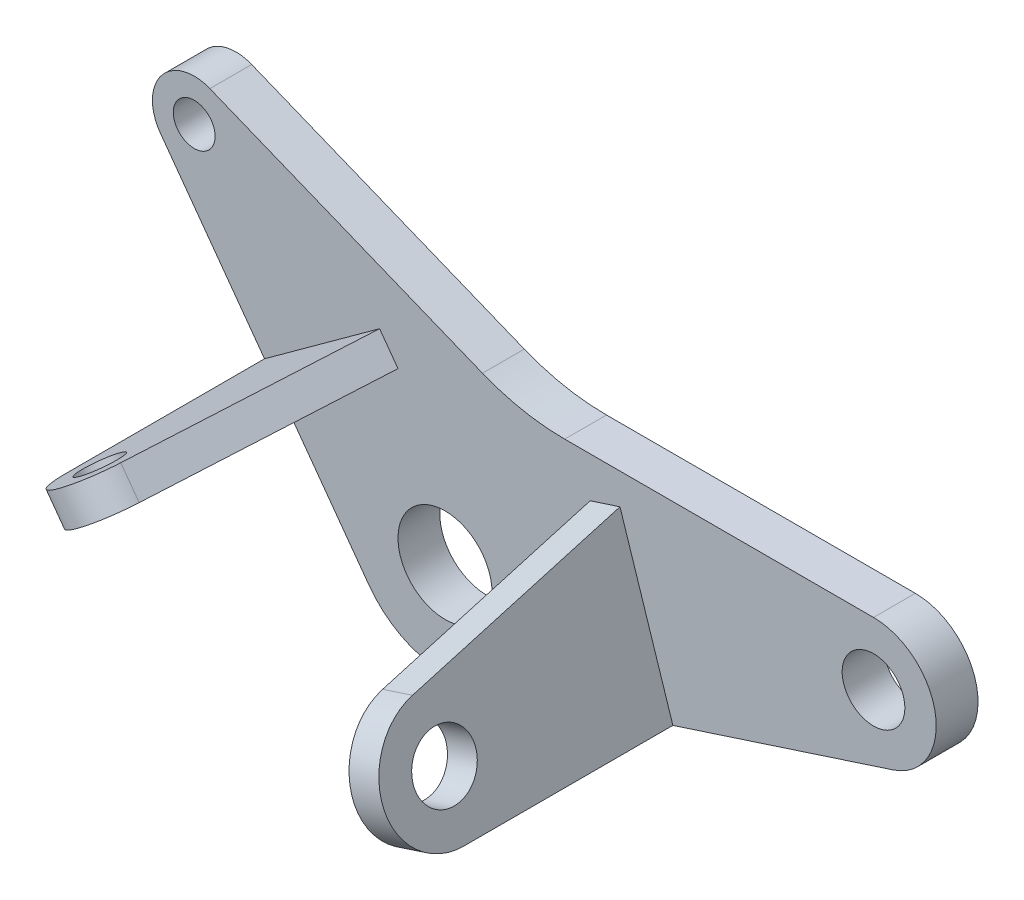
ISO-10303-21;
HEADER;
FILE_DESCRIPTION(('STEP AP214'),'2;1');
FILE_NAME('part.step','',(''),(''),'','','');
FILE_SCHEMA(('AUTOMOTIVE_DESIGN { 1 0 10303 214 1 1 1 1 }'));
ENDSEC;
DATA;
#1=APPLICATION_CONTEXT('core data for automotive mechanical design processes');
#2=APPLICATION_PROTOCOL_DEFINITION('international standard','automotive_design',2000,#1);
#3=PRODUCT_CONTEXT('',#1,'mechanical');
#4=PRODUCT('Part','Part','',(#3));
#5=PRODUCT_RELATED_PRODUCT_CATEGORY('part','',(#4));
#6=PRODUCT_DEFINITION_FORMATION('','',#4);
#7=PRODUCT_DEFINITION_CONTEXT('part definition',#1,'design');
#8=PRODUCT_DEFINITION('design','',#6,#7);
#9=PRODUCT_DEFINITION_SHAPE('','',#8);
#10=(LENGTH_UNIT() NAMED_UNIT(*) SI_UNIT(.MILLI.,.METRE.));
#11=(NAMED_UNIT(*) PLANE_ANGLE_UNIT() SI_UNIT($,.RADIAN.));
#12=(NAMED_UNIT(*) SI_UNIT($,.STERADIAN.) SOLID_ANGLE_UNIT());
#13=UNCERTAINTY_MEASURE_WITH_UNIT(LENGTH_MEASURE(1.E-05),#10,'distance_accuracy_value','');
#14=(GEOMETRIC_REPRESENTATION_CONTEXT(3) GLOBAL_UNCERTAINTY_ASSIGNED_CONTEXT((#13)) GLOBAL_UNIT_ASSIGNED_CONTEXT((#10,
#11,#12)) REPRESENTATION_CONTEXT('',''));
#15=CARTESIAN_POINT('',(0.,0.,0.));
#16=DIRECTION('',(0.,0.,1.));
#17=DIRECTION('',(1.,0.,0.));
#18=AXIS2_PLACEMENT_3D('',#15,#16,#17);
#19=CARTESIAN_POINT('',(0.,0.,8.));
#20=DIRECTION('',(0.,0.,1.));
#21=DIRECTION('',(1.,0.,0.));
#22=AXIS2_PLACEMENT_3D('',#19,#20,#21);
#23=PLANE('',#22);
#24=CARTESIAN_POINT('',(0.,0.,8.));
#25=DIRECTION('',(0.,0.,1.));
#26=DIRECTION('',(1.,0.,0.));
#27=AXIS2_PLACEMENT_3D('',#24,#25,#26);
#28=CIRCLE('',#27,9.);
#29=CARTESIAN_POINT('',(9.,0.,8.));
#30=VERTEX_POINT('',#29);
#31=EDGE_CURVE('E224',#30,#30,#28,.T.);
#32=ORIENTED_EDGE('',*,*,#31,.F.);
#33=EDGE_LOOP('',(#32));
#34=FACE_BOUND('',#33,.T.);
#35=CARTESIAN_POINT('',(82.,20.3346417456688,8.));
#36=DIRECTION('',(0.,0.,1.));
#37=DIRECTION('',(1.,0.,0.));
#38=AXIS2_PLACEMENT_3D('',#35,#36,#37);
#39=CIRCLE('',#38,6.);
#40=CARTESIAN_POINT('',(88.,20.3346417456688,8.));
#41=VERTEX_POINT('',#40);
#42=EDGE_CURVE('E226',#41,#41,#39,.T.);
#43=ORIENTED_EDGE('',*,*,#42,.F.);
#44=EDGE_LOOP('',(#43));
#45=FACE_BOUND('',#44,.T.);
#46=CARTESIAN_POINT('',(-48.,49.0533160155749,8.));
#47=DIRECTION('',(0.,0.,1.));
#48=DIRECTION('',(1.,0.,0.));
#49=AXIS2_PLACEMENT_3D('',#46,#47,#48);
#50=CIRCLE('',#49,4.);
#51=CARTESIAN_POINT('',(-44.,49.0533160155749,8.));
#52=VERTEX_POINT('',#51);
#53=EDGE_CURVE('E229',#52,#52,#50,.T.);
#54=ORIENTED_EDGE('',*,*,#53,.F.);
#55=EDGE_LOOP('',(#54));
#56=FACE_BOUND('',#55,.T.);
#57=DIRECTION('',(0.951056516295153,0.309016994374949,0.));
#58=VECTOR('',#57,1.);
#59=CARTESIAN_POINT('',(5.56230589874907,-17.1190172933128,8.));
#60=LINE('',#59,#58);
#61=CARTESIAN_POINT('',(5.56230589874907,-17.1190172933128,8.));
#62=VERTEX_POINT('',#61);
#63=CARTESIAN_POINT('',(37.8982274527843,-6.6124394845645,8.));
#64=VERTEX_POINT('',#63);
#65=EDGE_CURVE('E247',#62,#64,#60,.T.);
#66=ORIENTED_EDGE('',*,*,#65,.T.);
#67=DIRECTION('',(-0.309016994374949,0.951056516295153,0.));
#68=VECTOR('',#67,1.);
#69=CARTESIAN_POINT('',(27.7716325131749,24.5540150487133,8.));
#70=LINE('',#69,#68);
#71=CARTESIAN_POINT('',(27.7716325131749,24.5540150487133,8.));
#72=VERTEX_POINT('',#71);
#73=EDGE_CURVE('E178',#64,#72,#70,.T.);
#74=ORIENTED_EDGE('',*,*,#73,.T.);
#75=DIRECTION('',(-0.951056516295153,-0.309016994374949,0.));
#76=VECTOR('',#75,1.);
#77=CARTESIAN_POINT('',(33.4779716109458,26.408117014963,8.));
#78=LINE('',#77,#76);
#79=CARTESIAN_POINT('',(33.4779716109458,26.408117014963,8.));
#80=VERTEX_POINT('',#79);
#81=EDGE_CURVE('E166',#80,#72,#78,.T.);
#82=ORIENTED_EDGE('',*,*,#81,.F.);
#83=DIRECTION('',(-0.309016994374949,0.951056516295153,0.));
#84=VECTOR('',#83,1.);
#85=CARTESIAN_POINT('',(33.4779716109458,26.408117014963,8.));
#86=LINE('',#85,#84);
#87=CARTESIAN_POINT('',(43.6045665505552,-4.75833751831481,8.));
#88=VERTEX_POINT('',#87);
#89=EDGE_CURVE('E57',#88,#80,#86,.T.);
#90=ORIENTED_EDGE('',*,*,#89,.F.);
#91=CARTESIAN_POINT('',(85.7082039324994,8.92196355012699,8.));
#92=VERTEX_POINT('',#91);
#93=EDGE_CURVE('E244',#88,#92,#60,.T.);
#94=ORIENTED_EDGE('',*,*,#93,.T.);
#95=CARTESIAN_POINT('',(82.,20.3346417456688,8.));
#96=DIRECTION('',(0.,0.,1.));
#97=DIRECTION('',(1.,0.,0.));
#98=AXIS2_PLACEMENT_3D('',#95,#96,#97);
#99=CIRCLE('',#98,12.);
#100=CARTESIAN_POINT('',(82.,32.3346417456688,8.));
#101=VERTEX_POINT('',#100);
#102=EDGE_CURVE('E246',#92,#101,#99,.T.);
#103=ORIENTED_EDGE('',*,*,#102,.T.);
#104=DIRECTION('',(1.,0.,0.));
#105=VECTOR('',#104,1.);
#106=CARTESIAN_POINT('',(0.,32.3346417456688,8.));
#107=LINE('',#106,#105);
#108=CARTESIAN_POINT('',(22.8998811762111,32.3346417456688,8.));
#109=VERTEX_POINT('',#108);
#110=EDGE_CURVE('E253',#109,#101,#107,.T.);
#111=ORIENTED_EDGE('',*,*,#110,.F.);
#112=CARTESIAN_POINT('',(22.8998811762111,74.3346417456688,8.));
#113=DIRECTION('',(0.,0.,1.));
#114=DIRECTION('',(1.,0.,0.));
#115=AXIS2_PLACEMENT_3D('',#112,#113,#114);
#116=CIRCLE('',#115,42.);
#117=CARTESIAN_POINT('',(7.16640425274299,35.3929198538637,8.));
#118=VERTEX_POINT('',#117);
#119=EDGE_CURVE('E255',#118,#109,#116,.T.);
#120=ORIENTED_EDGE('',*,*,#119,.F.);
#121=DIRECTION('',(-0.92718385456679,0.374606593415907,0.));
#122=VECTOR('',#121,1.);
#123=CARTESIAN_POINT('',(13.2986562399496,32.9153292276025,8.));
#124=LINE('',#123,#122);
#125=CARTESIAN_POINT('',(-45.0031472526728,56.4707868521092,8.));
#126=VERTEX_POINT('',#125);
#127=EDGE_CURVE('E234',#118,#126,#124,.T.);
#128=ORIENTED_EDGE('',*,*,#127,.T.);
#129=CARTESIAN_POINT('',(-48.,49.0533160155749,8.));
#130=DIRECTION('',(0.,0.,1.));
#131=DIRECTION('',(1.,0.,0.));
#132=AXIS2_PLACEMENT_3D('',#129,#130,#131);
#133=CIRCLE('',#132,8.);
#134=CARTESIAN_POINT('',(-54.4721359549996,44.3510339972351,8.));
#135=VERTEX_POINT('',#134);
#136=EDGE_CURVE('E237',#126,#135,#133,.T.);
#137=ORIENTED_EDGE('',*,*,#136,.T.);
#138=DIRECTION('',(-0.587785252292478,0.809016994374944,0.));
#139=VECTOR('',#138,1.);
#140=CARTESIAN_POINT('',(-14.562305898749,-10.5801345412646,8.));
#141=LINE('',#140,#139);
#142=CARTESIAN_POINT('',(-34.5470044766932,16.9264432674835,8.));
#143=VERTEX_POINT('',#142);
#144=EDGE_CURVE('E239',#143,#135,#141,.T.);
#145=ORIENTED_EDGE('',*,*,#144,.F.);
#146=DIRECTION('',(-0.809016994374944,-0.587785252292478,0.));
#147=VECTOR('',#146,1.);
#148=CARTESIAN_POINT('',(-19.9846985779443,27.5065778087481,8.));
#149=LINE('',#148,#147);
#150=CARTESIAN_POINT('',(-12.5265973136641,32.9252055554183,8.));
#151=VERTEX_POINT('',#150);
#152=EDGE_CURVE('E198',#151,#143,#149,.T.);
#153=ORIENTED_EDGE('',*,*,#152,.F.);
#154=DIRECTION('',(-0.587785252292478,0.809016994374944,0.));
#155=VECTOR('',#154,1.);
#156=CARTESIAN_POINT('',(-8.99988579990927,28.0711035891686,8.));
#157=LINE('',#156,#155);
#158=CARTESIAN_POINT('',(-8.99988579990927,28.0711035891686,8.));
#159=VERTEX_POINT('',#158);
#160=EDGE_CURVE('E201',#159,#151,#157,.T.);
#161=ORIENTED_EDGE('',*,*,#160,.F.);
#162=DIRECTION('',(-0.809016994374944,-0.587785252292478,0.));
#163=VECTOR('',#162,1.);
#164=CARTESIAN_POINT('',(-16.4579870641894,22.6524758424985,8.));
#165=LINE('',#164,#163);
#166=CARTESIAN_POINT('',(-31.0202929629384,12.0723413012339,8.));
#167=VERTEX_POINT('',#166);
#168=EDGE_CURVE('E203',#159,#167,#165,.T.);
#169=ORIENTED_EDGE('',*,*,#168,.T.);
#170=CARTESIAN_POINT('',(-14.562305898749,-10.5801345412646,8.));
#171=VERTEX_POINT('',#170);
#172=EDGE_CURVE('E238',#171,#167,#141,.T.);
#173=ORIENTED_EDGE('',*,*,#172,.F.);
#174=CARTESIAN_POINT('',(0.,0.,8.));
#175=DIRECTION('',(0.,0.,1.));
#176=DIRECTION('',(1.,0.,0.));
#177=AXIS2_PLACEMENT_3D('',#174,#175,#176);
#178=CIRCLE('',#177,18.);
#179=EDGE_CURVE('E242',#171,#62,#178,.T.);
#180=ORIENTED_EDGE('',*,*,#179,.T.);
#181=EDGE_LOOP('',(#66,#74,#82,#90,#94,#103,#111,#120,#128,#137,#145,#153,#161,#169,#173,#180));
#182=FACE_BOUND('',#181,.T.);
#183=ADVANCED_FACE('F41',(#34,#45,#56,#182),#23,.T.);
#184=CARTESIAN_POINT('',(13.2986562399496,32.9153292276025,8.));
#185=DIRECTION('',(-0.374606593415907,-0.92718385456679,0.));
#186=DIRECTION('',(0.92718385456679,-0.374606593415907,0.));
#187=AXIS2_PLACEMENT_3D('',#184,#185,#186);
#188=PLANE('',#187);
#189=DIRECTION('',(-0.92718385456679,0.374606593415907,0.));
#190=VECTOR('',#189,1.);
#191=CARTESIAN_POINT('',(13.2986562399496,32.9153292276025,0.));
#192=LINE('',#191,#190);
#193=CARTESIAN_POINT('',(7.16640425274299,35.3929198538637,0.));
#194=VERTEX_POINT('',#193);
#195=CARTESIAN_POINT('',(-45.0031472526728,56.4707868521092,0.));
#196=VERTEX_POINT('',#195);
#197=EDGE_CURVE('E266',#194,#196,#192,.T.);
#198=ORIENTED_EDGE('',*,*,#197,.T.);
#199=DIRECTION('',(0.,0.,-1.));
#200=VECTOR('',#199,1.);
#201=CARTESIAN_POINT('',(-45.0031472526728,56.4707868521092,8.));
#202=LINE('',#201,#200);
#203=EDGE_CURVE('E11',#126,#196,#202,.T.);
#204=ORIENTED_EDGE('',*,*,#203,.F.);
#205=ORIENTED_EDGE('',*,*,#127,.F.);
#206=DIRECTION('',(0.,0.,-1.));
#207=VECTOR('',#206,1.);
#208=CARTESIAN_POINT('',(7.16640425274299,35.3929198538637,8.));
#209=LINE('',#208,#207);
#210=EDGE_CURVE('E260',#118,#194,#209,.T.);
#211=ORIENTED_EDGE('',*,*,#210,.T.);
#212=EDGE_LOOP('',(#198,#204,#205,#211));
#213=FACE_BOUND('',#212,.T.);
#214=ADVANCED_FACE('F338',(#213),#188,.F.);
#215=CARTESIAN_POINT('',(-48.,49.0533160155749,8.));
#216=DIRECTION('',(0.,0.,-1.));
#217=DIRECTION('',(-1.,0.,0.));
#218=AXIS2_PLACEMENT_3D('',#215,#216,#217);
#219=CYLINDRICAL_SURFACE('',#218,8.);
#220=CARTESIAN_POINT('',(-48.,49.0533160155749,0.));
#221=DIRECTION('',(0.,0.,1.));
#222=DIRECTION('',(1.,0.,0.));
#223=AXIS2_PLACEMENT_3D('',#220,#221,#222);
#224=CIRCLE('',#223,8.);
#225=CARTESIAN_POINT('',(-54.4721359549996,44.3510339972351,0.));
#226=VERTEX_POINT('',#225);
#227=EDGE_CURVE('E267',#196,#226,#224,.T.);
#228=ORIENTED_EDGE('',*,*,#227,.T.);
#229=DIRECTION('',(0.,0.,-1.));
#230=VECTOR('',#229,1.);
#231=CARTESIAN_POINT('',(-54.4721359549996,44.3510339972351,8.));
#232=LINE('',#231,#230);
#233=EDGE_CURVE('E47',#135,#226,#232,.T.);
#234=ORIENTED_EDGE('',*,*,#233,.F.);
#235=ORIENTED_EDGE('',*,*,#136,.F.);
#236=ORIENTED_EDGE('',*,*,#203,.T.);
#237=EDGE_LOOP('',(#228,#234,#235,#236));
#238=FACE_BOUND('',#237,.T.);
#239=ADVANCED_FACE('F303',(#238),#219,.T.);
#240=CARTESIAN_POINT('',(-14.562305898749,-10.5801345412646,8.));
#241=DIRECTION('',(-0.809016994374944,-0.587785252292478,0.));
#242=DIRECTION('',(0.587785252292478,-0.809016994374944,0.));
#243=AXIS2_PLACEMENT_3D('',#240,#241,#242);
#244=PLANE('',#243);
#245=DIRECTION('',(-0.587785252292478,0.809016994374944,0.));
#246=VECTOR('',#245,1.);
#247=CARTESIAN_POINT('',(-14.562305898749,-10.5801345412646,0.));
#248=LINE('',#247,#246);
#249=CARTESIAN_POINT('',(-14.562305898749,-10.5801345412646,0.));
#250=VERTEX_POINT('',#249);
#251=EDGE_CURVE('E275',#250,#226,#248,.T.);
#252=ORIENTED_EDGE('',*,*,#251,.F.);
#253=DIRECTION('',(0.,0.,-1.));
#254=VECTOR('',#253,1.);
#255=CARTESIAN_POINT('',(-14.562305898749,-10.5801345412646,8.));
#256=LINE('',#255,#254);
#257=EDGE_CURVE('E297',#171,#250,#256,.T.);
#258=ORIENTED_EDGE('',*,*,#257,.F.);
#259=ORIENTED_EDGE('',*,*,#172,.T.);
#260=DIRECTION('',(0.,0.,1.));
#261=VECTOR('',#260,1.);
#262=CARTESIAN_POINT('',(-31.0202929629384,12.0723413012339,0.));
#263=LINE('',#262,#261);
#264=CARTESIAN_POINT('',(-31.0202929629384,12.0723413012339,46.));
#265=VERTEX_POINT('',#264);
#266=EDGE_CURVE('E63',#167,#265,#263,.T.);
#267=ORIENTED_EDGE('',*,*,#266,.T.);
#268=DIRECTION('',(-0.587785252292478,0.809016994374944,0.));
#269=VECTOR('',#268,1.);
#270=CARTESIAN_POINT('',(-31.0202929629384,12.0723413012339,46.));
#271=LINE('',#270,#269);
#272=CARTESIAN_POINT('',(-34.5470044766932,16.9264432674835,46.));
#273=VERTEX_POINT('',#272);
#274=EDGE_CURVE('E217',#265,#273,#271,.T.);
#275=ORIENTED_EDGE('',*,*,#274,.T.);
#276=DIRECTION('',(0.,0.,1.));
#277=VECTOR('',#276,1.);
#278=CARTESIAN_POINT('',(-34.5470044766932,16.9264432674835,0.));
#279=LINE('',#278,#277);
#280=EDGE_CURVE('E215',#143,#273,#279,.T.);
#281=ORIENTED_EDGE('',*,*,#280,.F.);
#282=ORIENTED_EDGE('',*,*,#144,.T.);
#283=ORIENTED_EDGE('',*,*,#233,.T.);
#284=EDGE_LOOP('',(#252,#258,#259,#267,#275,#281,#282,#283));
#285=FACE_BOUND('',#284,.T.);
#286=ADVANCED_FACE('F305',(#285),#244,.T.);
#287=CARTESIAN_POINT('',(0.,0.,8.));
#288=DIRECTION('',(0.,0.,-1.));
#289=DIRECTION('',(-1.,0.,0.));
#290=AXIS2_PLACEMENT_3D('',#287,#288,#289);
#291=CYLINDRICAL_SURFACE('',#290,18.);
#292=CARTESIAN_POINT('',(0.,0.,0.));
#293=DIRECTION('',(0.,0.,1.));
#294=DIRECTION('',(1.,0.,0.));
#295=AXIS2_PLACEMENT_3D('',#292,#293,#294);
#296=CIRCLE('',#295,18.);
#297=CARTESIAN_POINT('',(5.56230589874907,-17.1190172933128,0.));
#298=VERTEX_POINT('',#297);
#299=EDGE_CURVE('E274',#250,#298,#296,.T.);
#300=ORIENTED_EDGE('',*,*,#299,.T.);
#301=DIRECTION('',(0.,0.,-1.));
#302=VECTOR('',#301,1.);
#303=CARTESIAN_POINT('',(5.56230589874907,-17.1190172933128,8.));
#304=LINE('',#303,#302);
#305=EDGE_CURVE('E293',#62,#298,#304,.T.);
#306=ORIENTED_EDGE('',*,*,#305,.F.);
#307=ORIENTED_EDGE('',*,*,#179,.F.);
#308=ORIENTED_EDGE('',*,*,#257,.T.);
#309=EDGE_LOOP('',(#300,#306,#307,#308));
#310=FACE_BOUND('',#309,.T.);
#311=ADVANCED_FACE('F312',(#310),#291,.T.);
#312=CARTESIAN_POINT('',(5.56230589874907,-17.1190172933128,8.));
#313=DIRECTION('',(-0.309016994374949,0.951056516295153,0.));
#314=DIRECTION('',(-0.951056516295153,-0.309016994374949,0.));
#315=AXIS2_PLACEMENT_3D('',#312,#313,#314);
#316=PLANE('',#315);
#317=DIRECTION('',(0.951056516295153,0.309016994374949,0.));
#318=VECTOR('',#317,1.);
#319=CARTESIAN_POINT('',(5.56230589874907,-17.1190172933128,0.));
#320=LINE('',#319,#318);
#321=CARTESIAN_POINT('',(85.7082039324994,8.92196355012699,0.));
#322=VERTEX_POINT('',#321);
#323=EDGE_CURVE('E280',#298,#322,#320,.T.);
#324=ORIENTED_EDGE('',*,*,#323,.T.);
#325=DIRECTION('',(0.,0.,-1.));
#326=VECTOR('',#325,1.);
#327=CARTESIAN_POINT('',(85.7082039324994,8.92196355012699,8.));
#328=LINE('',#327,#326);
#329=EDGE_CURVE('E295',#92,#322,#328,.T.);
#330=ORIENTED_EDGE('',*,*,#329,.F.);
#331=ORIENTED_EDGE('',*,*,#93,.F.);
#332=DIRECTION('',(0.,0.,-1.));
#333=VECTOR('',#332,1.);
#334=CARTESIAN_POINT('',(43.6045665505552,-4.75833751831481,8.));
#335=LINE('',#334,#333);
#336=CARTESIAN_POINT('',(43.6045665505552,-4.75833751831481,48.));
#337=VERTEX_POINT('',#336);
#338=EDGE_CURVE('E174',#337,#88,#335,.T.);
#339=ORIENTED_EDGE('',*,*,#338,.F.);
#340=DIRECTION('',(-0.951056516295153,-0.309016994374949,0.));
#341=VECTOR('',#340,1.);
#342=CARTESIAN_POINT('',(43.6045665505552,-4.75833751831481,48.));
#343=LINE('',#342,#341);
#344=CARTESIAN_POINT('',(37.8982274527843,-6.61243948456451,48.));
#345=VERTEX_POINT('',#344);
#346=EDGE_CURVE('E168',#337,#345,#343,.T.);
#347=ORIENTED_EDGE('',*,*,#346,.T.);
#348=DIRECTION('',(0.,0.,-1.));
#349=VECTOR('',#348,1.);
#350=CARTESIAN_POINT('',(37.8982274527843,-6.6124394845645,8.));
#351=LINE('',#350,#349);
#352=EDGE_CURVE('E190',#345,#64,#351,.T.);
#353=ORIENTED_EDGE('',*,*,#352,.T.);
#354=ORIENTED_EDGE('',*,*,#65,.F.);
#355=ORIENTED_EDGE('',*,*,#305,.T.);
#356=EDGE_LOOP('',(#324,#330,#331,#339,#347,#353,#354,#355));
#357=FACE_BOUND('',#356,.T.);
#358=ADVANCED_FACE('F317',(#357),#316,.F.);
#359=CARTESIAN_POINT('',(82.,20.3346417456688,8.));
#360=DIRECTION('',(0.,0.,-1.));
#361=DIRECTION('',(-1.,0.,0.));
#362=AXIS2_PLACEMENT_3D('',#359,#360,#361);
#363=CYLINDRICAL_SURFACE('',#362,12.);
#364=CARTESIAN_POINT('',(82.,20.3346417456688,0.));
#365=DIRECTION('',(0.,0.,1.));
#366=DIRECTION('',(1.,0.,0.));
#367=AXIS2_PLACEMENT_3D('',#364,#365,#366);
#368=CIRCLE('',#367,12.);
#369=CARTESIAN_POINT('',(82.,32.3346417456688,0.));
#370=VERTEX_POINT('',#369);
#371=EDGE_CURVE('E276',#322,#370,#368,.T.);
#372=ORIENTED_EDGE('',*,*,#371,.T.);
#373=DIRECTION('',(0.,0.,-1.));
#374=VECTOR('',#373,1.);
#375=CARTESIAN_POINT('',(82.,32.3346417456688,8.));
#376=LINE('',#375,#374);
#377=EDGE_CURVE('E288',#101,#370,#376,.T.);
#378=ORIENTED_EDGE('',*,*,#377,.F.);
#379=ORIENTED_EDGE('',*,*,#102,.F.);
#380=ORIENTED_EDGE('',*,*,#329,.T.);
#381=EDGE_LOOP('',(#372,#378,#379,#380));
#382=FACE_BOUND('',#381,.T.);
#383=ADVANCED_FACE('F346',(#382),#363,.T.);
#384=CARTESIAN_POINT('',(0.,32.3346417456688,8.));
#385=DIRECTION('',(0.,1.,0.));
#386=DIRECTION('',(-1.,0.,0.));
#387=AXIS2_PLACEMENT_3D('',#384,#385,#386);
#388=PLANE('',#387);
#389=DIRECTION('',(1.,0.,0.));
#390=VECTOR('',#389,1.);
#391=CARTESIAN_POINT('',(0.,32.3346417456688,0.));
#392=LINE('',#391,#390);
#393=CARTESIAN_POINT('',(22.8998811762111,32.3346417456688,0.));
#394=VERTEX_POINT('',#393);
#395=EDGE_CURVE('E285',#394,#370,#392,.T.);
#396=ORIENTED_EDGE('',*,*,#395,.F.);
#397=DIRECTION('',(0.,0.,-1.));
#398=VECTOR('',#397,1.);
#399=CARTESIAN_POINT('',(22.8998811762111,32.3346417456688,8.));
#400=LINE('',#399,#398);
#401=EDGE_CURVE('E289',#109,#394,#400,.T.);
#402=ORIENTED_EDGE('',*,*,#401,.F.);
#403=ORIENTED_EDGE('',*,*,#110,.T.);
#404=ORIENTED_EDGE('',*,*,#377,.T.);
#405=EDGE_LOOP('',(#396,#402,#403,#404));
#406=FACE_BOUND('',#405,.T.);
#407=ADVANCED_FACE('F343',(#406),#388,.T.);
#408=CARTESIAN_POINT('',(-48.,49.0533160155749,8.));
#409=DIRECTION('',(0.,0.,-1.));
#410=DIRECTION('',(-1.,0.,0.));
#411=AXIS2_PLACEMENT_3D('',#408,#409,#410);
#412=CYLINDRICAL_SURFACE('',#411,4.);
#413=ORIENTED_EDGE('',*,*,#53,.T.);
#414=EDGE_LOOP('',(#413));
#415=FACE_BOUND('',#414,.T.);
#416=CARTESIAN_POINT('',(-48.,49.0533160155749,0.));
#417=DIRECTION('',(0.,0.,1.));
#418=DIRECTION('',(1.,0.,0.));
#419=AXIS2_PLACEMENT_3D('',#416,#417,#418);
#420=CIRCLE('',#419,4.);
#421=CARTESIAN_POINT('',(-44.,49.0533160155749,0.));
#422=VERTEX_POINT('',#421);
#423=EDGE_CURVE('E263',#422,#422,#420,.T.);
#424=ORIENTED_EDGE('',*,*,#423,.F.);
#425=EDGE_LOOP('',(#424));
#426=FACE_BOUND('',#425,.T.);
#427=ADVANCED_FACE('F394',(#415,#426),#412,.F.);
#428=CARTESIAN_POINT('',(82.,20.3346417456688,8.));
#429=DIRECTION('',(0.,0.,-1.));
#430=DIRECTION('',(-1.,0.,0.));
#431=AXIS2_PLACEMENT_3D('',#428,#429,#430);
#432=CYLINDRICAL_SURFACE('',#431,6.);
#433=ORIENTED_EDGE('',*,*,#42,.T.);
#434=EDGE_LOOP('',(#433));
#435=FACE_BOUND('',#434,.T.);
#436=CARTESIAN_POINT('',(82.,20.3346417456688,0.));
#437=DIRECTION('',(0.,0.,1.));
#438=DIRECTION('',(1.,0.,0.));
#439=AXIS2_PLACEMENT_3D('',#436,#437,#438);
#440=CIRCLE('',#439,6.);
#441=CARTESIAN_POINT('',(88.,20.3346417456688,0.));
#442=VERTEX_POINT('',#441);
#443=EDGE_CURVE('E257',#442,#442,#440,.T.);
#444=ORIENTED_EDGE('',*,*,#443,.F.);
#445=EDGE_LOOP('',(#444));
#446=FACE_BOUND('',#445,.T.);
#447=ADVANCED_FACE('F406',(#435,#446),#432,.F.);
#448=CARTESIAN_POINT('',(0.,0.,8.));
#449=DIRECTION('',(0.,0.,-1.));
#450=DIRECTION('',(-1.,0.,0.));
#451=AXIS2_PLACEMENT_3D('',#448,#449,#450);
#452=CYLINDRICAL_SURFACE('',#451,9.);
#453=ORIENTED_EDGE('',*,*,#31,.T.);
#454=EDGE_LOOP('',(#453));
#455=FACE_BOUND('',#454,.T.);
#456=CARTESIAN_POINT('',(0.,0.,0.));
#457=DIRECTION('',(0.,0.,1.));
#458=DIRECTION('',(1.,0.,0.));
#459=AXIS2_PLACEMENT_3D('',#456,#457,#458);
#460=CIRCLE('',#459,9.);
#461=CARTESIAN_POINT('',(9.,0.,0.));
#462=VERTEX_POINT('',#461);
#463=EDGE_CURVE('E225',#462,#462,#460,.T.);
#464=ORIENTED_EDGE('',*,*,#463,.F.);
#465=EDGE_LOOP('',(#464));
#466=FACE_BOUND('',#465,.T.);
#467=ADVANCED_FACE('F43',(#455,#466),#452,.F.);
#468=CARTESIAN_POINT('',(22.8998811762111,74.3346417456688,8.));
#469=DIRECTION('',(0.,0.,-1.));
#470=DIRECTION('',(-1.,0.,0.));
#471=AXIS2_PLACEMENT_3D('',#468,#469,#470);
#472=CYLINDRICAL_SURFACE('',#471,42.);
#473=CARTESIAN_POINT('',(22.8998811762111,74.3346417456688,0.));
#474=DIRECTION('',(0.,0.,1.));
#475=DIRECTION('',(1.,0.,0.));
#476=AXIS2_PLACEMENT_3D('',#473,#474,#475);
#477=CIRCLE('',#476,42.);
#478=EDGE_CURVE('E230',#194,#394,#477,.T.);
#479=ORIENTED_EDGE('',*,*,#478,.F.);
#480=ORIENTED_EDGE('',*,*,#210,.F.);
#481=ORIENTED_EDGE('',*,*,#119,.T.);
#482=ORIENTED_EDGE('',*,*,#401,.T.);
#483=EDGE_LOOP('',(#479,#480,#481,#482));
#484=FACE_BOUND('',#483,.T.);
#485=ADVANCED_FACE('F345',(#484),#472,.F.);
#486=CARTESIAN_POINT('',(0.,0.,0.));
#487=DIRECTION('',(0.,0.,1.));
#488=DIRECTION('',(1.,0.,0.));
#489=AXIS2_PLACEMENT_3D('',#486,#487,#488);
#490=PLANE('',#489);
#491=ORIENTED_EDGE('',*,*,#463,.T.);
#492=EDGE_LOOP('',(#491));
#493=FACE_BOUND('',#492,.T.);
#494=ORIENTED_EDGE('',*,*,#443,.T.);
#495=EDGE_LOOP('',(#494));
#496=FACE_BOUND('',#495,.T.);
#497=ORIENTED_EDGE('',*,*,#423,.T.);
#498=EDGE_LOOP('',(#497));
#499=FACE_BOUND('',#498,.T.);
#500=ORIENTED_EDGE('',*,*,#197,.F.);
#501=ORIENTED_EDGE('',*,*,#478,.T.);
#502=ORIENTED_EDGE('',*,*,#395,.T.);
#503=ORIENTED_EDGE('',*,*,#371,.F.);
#504=ORIENTED_EDGE('',*,*,#323,.F.);
#505=ORIENTED_EDGE('',*,*,#299,.F.);
#506=ORIENTED_EDGE('',*,*,#251,.T.);
#507=ORIENTED_EDGE('',*,*,#227,.F.);
#508=EDGE_LOOP('',(#500,#501,#502,#503,#504,#505,#506,#507));
#509=FACE_BOUND('',#508,.T.);
#510=ADVANCED_FACE('F309',(#493,#496,#499,#509),#490,.F.);
#511=CARTESIAN_POINT('',(-7.85166738134673,28.9053331016933,3.0503963137721));
#512=DIRECTION('',(0.777677048055781,0.5650154484662,0.275637355816996));
#513=DIRECTION('',(-0.587785252292478,0.809016994374944,0.));
#514=AXIS2_PLACEMENT_3D('',#511,#512,#513);
#515=PLANE('',#514);
#516=DIRECTION('',(0.222995305140523,0.162015572730125,-0.96126169593832));
#517=VECTOR('',#516,1.);
#518=CARTESIAN_POINT('',(-11.3783788951016,33.759435067943,3.0503963137721));
#519=LINE('',#518,#517);
#520=CARTESIAN_POINT('',(-21.8534521372475,26.148848873553,48.205098846536));
#521=VERTEX_POINT('',#520);
#522=EDGE_CURVE('E206',#521,#151,#519,.T.);
#523=ORIENTED_EDGE('',*,*,#522,.F.);
#524=DIRECTION('',(-0.587785252292478,0.809016994374944,0.));
#525=VECTOR('',#524,1.);
#526=CARTESIAN_POINT('',(-18.3267406234926,21.2947469073033,48.205098846536));
#527=LINE('',#526,#525);
#528=CARTESIAN_POINT('',(-18.3267406234926,21.2947469073033,48.205098846536));
#529=VERTEX_POINT('',#528);
#530=EDGE_CURVE('E219',#529,#521,#527,.T.);
#531=ORIENTED_EDGE('',*,*,#530,.F.);
#532=DIRECTION('',(0.222995305140523,0.162015572730125,-0.96126169593832));
#533=VECTOR('',#532,1.);
#534=CARTESIAN_POINT('',(-7.85166738134673,28.9053331016933,3.0503963137721));
#535=LINE('',#534,#533);
#536=EDGE_CURVE('E193',#529,#159,#535,.T.);
#537=ORIENTED_EDGE('',*,*,#536,.T.);
#538=ORIENTED_EDGE('',*,*,#160,.T.);
#539=EDGE_LOOP('',(#523,#531,#537,#538));
#540=FACE_BOUND('',#539,.T.);
#541=ADVANCED_FACE('F386',(#540),#515,.T.);
#542=CARTESIAN_POINT('',(-24.5481570079388,16.7746233195737,46.));
#543=DIRECTION('',(-0.587785252292478,0.809016994374944,0.));
#544=DIRECTION('',(-0.809016994374944,-0.587785252292478,0.));
#545=AXIS2_PLACEMENT_3D('',#542,#543,#544);
#546=CYLINDRICAL_SURFACE('',#545,8.);
#547=CARTESIAN_POINT('',(-28.0748685216937,21.6287252858234,46.));
#548=DIRECTION('',(0.587785252292478,-0.809016994374944,0.));
#549=DIRECTION('',(0.809016994374944,0.587785252292478,0.));
#550=AXIS2_PLACEMENT_3D('',#547,#548,#549);
#551=CIRCLE('',#550,8.);
#552=EDGE_CURVE('E207',#521,#273,#551,.T.);
#553=ORIENTED_EDGE('',*,*,#552,.T.);
#554=ORIENTED_EDGE('',*,*,#274,.F.);
#555=CARTESIAN_POINT('',(-24.5481570079388,16.7746233195737,46.));
#556=DIRECTION('',(0.587785252292478,-0.809016994374944,0.));
#557=DIRECTION('',(0.809016994374944,0.587785252292478,0.));
#558=AXIS2_PLACEMENT_3D('',#555,#556,#557);
#559=CIRCLE('',#558,8.);
#560=EDGE_CURVE('E196',#529,#265,#559,.T.);
#561=ORIENTED_EDGE('',*,*,#560,.F.);
#562=ORIENTED_EDGE('',*,*,#530,.T.);
#563=EDGE_LOOP('',(#553,#554,#561,#562));
#564=FACE_BOUND('',#563,.T.);
#565=ADVANCED_FACE('F329',(#564),#546,.T.);
#566=CARTESIAN_POINT('',(-24.5481570079388,16.7746233195737,46.));
#567=DIRECTION('',(-0.587785252292478,0.809016994374944,0.));
#568=DIRECTION('',(-0.809016994374944,-0.587785252292478,0.));
#569=AXIS2_PLACEMENT_3D('',#566,#567,#568);
#570=CYLINDRICAL_SURFACE('',#569,4.00000000000001);
#571=CARTESIAN_POINT('',(-24.5481570079388,16.7746233195737,46.));
#572=DIRECTION('',(0.587785252292478,-0.809016994374944,0.));
#573=DIRECTION('',(0.809016994374944,0.587785252292478,0.));
#574=AXIS2_PLACEMENT_3D('',#571,#572,#573);
#575=CIRCLE('',#574,4.00000000000001);
#576=CARTESIAN_POINT('',(-21.3120890304391,19.1257643287436,46.));
#577=VERTEX_POINT('',#576);
#578=EDGE_CURVE('E195',#577,#577,#575,.T.);
#579=ORIENTED_EDGE('',*,*,#578,.T.);
#580=EDGE_LOOP('',(#579));
#581=FACE_BOUND('',#580,.T.);
#582=CARTESIAN_POINT('',(-28.0748685216937,21.6287252858234,46.));
#583=DIRECTION('',(0.587785252292478,-0.809016994374944,0.));
#584=DIRECTION('',(0.809016994374944,0.587785252292478,0.));
#585=AXIS2_PLACEMENT_3D('',#582,#583,#584);
#586=CIRCLE('',#585,4.00000000000001);
#587=CARTESIAN_POINT('',(-24.8388005441939,23.9798662949933,46.));
#588=VERTEX_POINT('',#587);
#589=EDGE_CURVE('E192',#588,#588,#586,.T.);
#590=ORIENTED_EDGE('',*,*,#589,.F.);
#591=EDGE_LOOP('',(#590));
#592=FACE_BOUND('',#591,.T.);
#593=ADVANCED_FACE('F384',(#581,#592),#570,.F.);
#594=CARTESIAN_POINT('',(-16.4579870641894,22.6524758424985,0.));
#595=DIRECTION('',(0.587785252292478,-0.809016994374944,0.));
#596=DIRECTION('',(0.809016994374944,0.587785252292478,0.));
#597=AXIS2_PLACEMENT_3D('',#594,#595,#596);
#598=PLANE('',#597);
#599=ORIENTED_EDGE('',*,*,#578,.F.);
#600=EDGE_LOOP('',(#599));
#601=FACE_BOUND('',#600,.T.);
#602=ORIENTED_EDGE('',*,*,#536,.F.);
#603=ORIENTED_EDGE('',*,*,#560,.T.);
#604=ORIENTED_EDGE('',*,*,#266,.F.);
#605=ORIENTED_EDGE('',*,*,#168,.F.);
#606=EDGE_LOOP('',(#602,#603,#604,#605));
#607=FACE_BOUND('',#606,.T.);
#608=ADVANCED_FACE('F367',(#601,#607),#598,.T.);
#609=CARTESIAN_POINT('',(-19.9846985779443,27.5065778087481,0.));
#610=DIRECTION('',(0.587785252292478,-0.809016994374944,0.));
#611=DIRECTION('',(0.809016994374944,0.587785252292478,0.));
#612=AXIS2_PLACEMENT_3D('',#609,#610,#611);
#613=PLANE('',#612);
#614=ORIENTED_EDGE('',*,*,#589,.T.);
#615=EDGE_LOOP('',(#614));
#616=FACE_BOUND('',#615,.T.);
#617=ORIENTED_EDGE('',*,*,#522,.T.);
#618=ORIENTED_EDGE('',*,*,#152,.T.);
#619=ORIENTED_EDGE('',*,*,#280,.T.);
#620=ORIENTED_EDGE('',*,*,#552,.F.);
#621=EDGE_LOOP('',(#617,#618,#619,#620));
#622=FACE_BOUND('',#621,.T.);
#623=ADVANCED_FACE('F334',(#616,#622),#613,.F.);
#624=CARTESIAN_POINT('',(39.8963626180558,6.65434067722702,48.));
#625=DIRECTION('',(0.951056516295153,0.309016994374949,0.));
#626=DIRECTION('',(-0.309016994374949,0.951056516295153,0.));
#627=AXIS2_PLACEMENT_3D('',#624,#625,#626);
#628=PLANE('',#627);
#629=ORIENTED_EDGE('',*,*,#89,.T.);
#630=DIRECTION('',(0.0642482457919167,-0.197735768366171,0.978147600733806));
#631=VECTOR('',#630,1.);
#632=CARTESIAN_POINT('',(36.2691918384499,17.8176244721433,50.4949402898131));
#633=LINE('',#632,#631);
#634=CARTESIAN_POINT('',(36.2691918384499,17.8176244721433,50.4949402898131));
#635=VERTEX_POINT('',#634);
#636=EDGE_CURVE('E155',#80,#635,#633,.T.);
#637=ORIENTED_EDGE('',*,*,#636,.T.);
#638=CARTESIAN_POINT('',(39.8963626180558,6.65434067722702,48.));
#639=DIRECTION('',(0.951056516295153,0.309016994374949,0.));
#640=DIRECTION('',(-0.309016994374949,0.951056516295153,0.));
#641=AXIS2_PLACEMENT_3D('',#638,#639,#640);
#642=CIRCLE('',#641,12.);
#643=EDGE_CURVE('E160',#635,#337,#642,.T.);
#644=ORIENTED_EDGE('',*,*,#643,.T.);
#645=ORIENTED_EDGE('',*,*,#338,.T.);
#646=EDGE_LOOP('',(#629,#637,#644,#645));
#647=FACE_BOUND('',#646,.T.);
#648=CARTESIAN_POINT('',(39.8963626180558,6.65434067722702,48.));
#649=DIRECTION('',(0.951056516295153,0.309016994374949,0.));
#650=DIRECTION('',(-0.309016994374949,0.951056516295153,0.));
#651=AXIS2_PLACEMENT_3D('',#648,#649,#650);
#652=CIRCLE('',#651,5.99999999999999);
#653=CARTESIAN_POINT('',(38.0422606518061,12.3606797749979,48.));
#654=VERTEX_POINT('',#653);
#655=EDGE_CURVE('E181',#654,#654,#652,.T.);
#656=ORIENTED_EDGE('',*,*,#655,.F.);
#657=EDGE_LOOP('',(#656));
#658=FACE_BOUND('',#657,.T.);
#659=ADVANCED_FACE('F152',(#647,#658),#628,.T.);
#660=CARTESIAN_POINT('',(34.1900235202849,4.80023871097733,48.));
#661=DIRECTION('',(0.951056516295153,0.309016994374949,0.));
#662=DIRECTION('',(-0.309016994374949,0.951056516295153,0.));
#663=AXIS2_PLACEMENT_3D('',#660,#661,#662);
#664=PLANE('',#663);
#665=ORIENTED_EDGE('',*,*,#73,.F.);
#666=ORIENTED_EDGE('',*,*,#352,.F.);
#667=CARTESIAN_POINT('',(34.1900235202849,4.80023871097733,48.));
#668=DIRECTION('',(0.951056516295153,0.309016994374949,0.));
#669=DIRECTION('',(-0.309016994374949,0.951056516295153,0.));
#670=AXIS2_PLACEMENT_3D('',#667,#668,#669);
#671=CIRCLE('',#670,12.);
#672=CARTESIAN_POINT('',(30.562852740679,15.9635225058936,50.4949402898131));
#673=VERTEX_POINT('',#672);
#674=EDGE_CURVE('E183',#673,#345,#671,.T.);
#675=ORIENTED_EDGE('',*,*,#674,.F.);
#676=DIRECTION('',(0.0642482457919167,-0.197735768366171,0.978147600733806));
#677=VECTOR('',#676,1.);
#678=CARTESIAN_POINT('',(30.562852740679,15.9635225058936,50.4949402898131));
#679=LINE('',#678,#677);
#680=EDGE_CURVE('E167',#72,#673,#679,.T.);
#681=ORIENTED_EDGE('',*,*,#680,.F.);
#682=EDGE_LOOP('',(#665,#666,#675,#681));
#683=FACE_BOUND('',#682,.T.);
#684=CARTESIAN_POINT('',(34.1900235202849,4.80023871097733,48.));
#685=DIRECTION('',(0.951056516295153,0.309016994374949,0.));
#686=DIRECTION('',(-0.309016994374949,0.951056516295153,0.));
#687=AXIS2_PLACEMENT_3D('',#684,#685,#686);
#688=CIRCLE('',#687,5.99999999999999);
#689=CARTESIAN_POINT('',(32.3359215540352,10.5065778087482,48.));
#690=VERTEX_POINT('',#689);
#691=EDGE_CURVE('E355',#690,#690,#688,.T.);
#692=ORIENTED_EDGE('',*,*,#691,.T.);
#693=EDGE_LOOP('',(#692));
#694=FACE_BOUND('',#693,.T.);
#695=ADVANCED_FACE('F363',(#683,#694),#664,.F.);
#696=CARTESIAN_POINT('',(36.2691918384499,17.8176244721433,50.4949402898131));
#697=DIRECTION('',(0.302264231633828,-0.930273649576356,-0.207911690817757));
#698=DIRECTION('',(0.951056516295153,0.309016994374949,0.));
#699=AXIS2_PLACEMENT_3D('',#696,#697,#698);
#700=PLANE('',#699);
#701=ORIENTED_EDGE('',*,*,#680,.T.);
#702=DIRECTION('',(-0.951056516295153,-0.309016994374949,0.));
#703=VECTOR('',#702,1.);
#704=CARTESIAN_POINT('',(36.2691918384499,17.8176244721433,50.4949402898131));
#705=LINE('',#704,#703);
#706=EDGE_CURVE('E163',#635,#673,#705,.T.);
#707=ORIENTED_EDGE('',*,*,#706,.F.);
#708=ORIENTED_EDGE('',*,*,#636,.F.);
#709=ORIENTED_EDGE('',*,*,#81,.T.);
#710=EDGE_LOOP('',(#701,#707,#708,#709));
#711=FACE_BOUND('',#710,.T.);
#712=ADVANCED_FACE('F164',(#711),#700,.F.);
#713=CARTESIAN_POINT('',(39.8963626180558,6.65434067722702,48.));
#714=DIRECTION('',(-0.951056516295153,-0.309016994374949,0.));
#715=DIRECTION('',(0.309016994374949,-0.951056516295153,0.));
#716=AXIS2_PLACEMENT_3D('',#713,#714,#715);
#717=CYLINDRICAL_SURFACE('',#716,12.);
#718=ORIENTED_EDGE('',*,*,#674,.T.);
#719=ORIENTED_EDGE('',*,*,#346,.F.);
#720=ORIENTED_EDGE('',*,*,#643,.F.);
#721=ORIENTED_EDGE('',*,*,#706,.T.);
#722=EDGE_LOOP('',(#718,#719,#720,#721));
#723=FACE_BOUND('',#722,.T.);
#724=ADVANCED_FACE('F175',(#723),#717,.T.);
#725=CARTESIAN_POINT('',(39.8963626180558,6.65434067722702,48.));
#726=DIRECTION('',(-0.951056516295153,-0.309016994374949,0.));
#727=DIRECTION('',(0.309016994374949,-0.951056516295153,0.));
#728=AXIS2_PLACEMENT_3D('',#725,#726,#727);
#729=CYLINDRICAL_SURFACE('',#728,5.99999999999999);
#730=ORIENTED_EDGE('',*,*,#655,.T.);
#731=EDGE_LOOP('',(#730));
#732=FACE_BOUND('',#731,.T.);
#733=ORIENTED_EDGE('',*,*,#691,.F.);
#734=EDGE_LOOP('',(#733));
#735=FACE_BOUND('',#734,.T.);
#736=ADVANCED_FACE('F359',(#732,#735),#729,.F.);
#737=CLOSED_SHELL('',(#183,#214,#239,#286,#311,#358,#383,#407,#427,#447,#467,#485,#510,#541,
#565,#593,#608,#623,#659,#695,#712,#724,#736));
#738=MANIFOLD_SOLID_BREP('B2',#737);
#739=ADVANCED_BREP_SHAPE_REPRESENTATION('',(#18,#738),#14);
#740=SHAPE_DEFINITION_REPRESENTATION(#9,#739);
ENDSEC;
END-ISO-10303-21;
